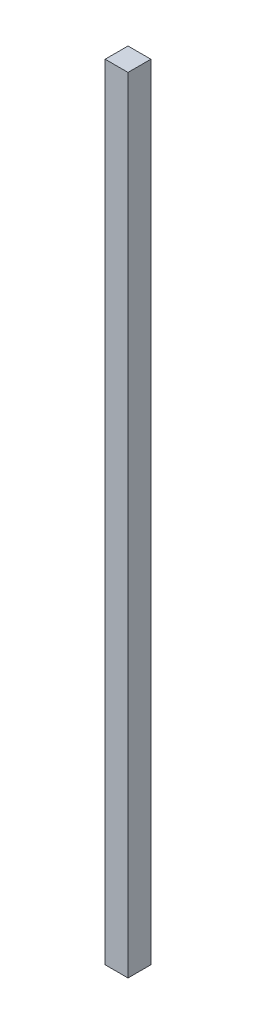
ISO-10303-21;
HEADER;
FILE_DESCRIPTION(('STEP AP214'),'2;1');
FILE_NAME('part.step','',(''),(''),'','','');
FILE_SCHEMA(('AUTOMOTIVE_DESIGN { 1 0 10303 214 1 1 1 1 }'));
ENDSEC;
DATA;
#1=APPLICATION_CONTEXT('core data for automotive mechanical design processes');
#2=APPLICATION_PROTOCOL_DEFINITION('international standard','automotive_design',2000,#1);
#3=PRODUCT_CONTEXT('',#1,'mechanical');
#4=PRODUCT('Part','Part','',(#3));
#5=PRODUCT_RELATED_PRODUCT_CATEGORY('part','',(#4));
#6=PRODUCT_DEFINITION_FORMATION('','',#4);
#7=PRODUCT_DEFINITION_CONTEXT('part definition',#1,'design');
#8=PRODUCT_DEFINITION('design','',#6,#7);
#9=PRODUCT_DEFINITION_SHAPE('','',#8);
#10=(LENGTH_UNIT() NAMED_UNIT(*) SI_UNIT(.MILLI.,.METRE.));
#11=(NAMED_UNIT(*) PLANE_ANGLE_UNIT() SI_UNIT($,.RADIAN.));
#12=(NAMED_UNIT(*) SI_UNIT($,.STERADIAN.) SOLID_ANGLE_UNIT());
#13=UNCERTAINTY_MEASURE_WITH_UNIT(LENGTH_MEASURE(1.E-05),#10,'distance_accuracy_value','');
#14=(GEOMETRIC_REPRESENTATION_CONTEXT(3) GLOBAL_UNCERTAINTY_ASSIGNED_CONTEXT((#13)) GLOBAL_UNIT_ASSIGNED_CONTEXT((#10,
#11,#12)) REPRESENTATION_CONTEXT('',''));
#15=CARTESIAN_POINT('',(0.,0.,0.));
#16=DIRECTION('',(0.,0.,1.));
#17=DIRECTION('',(1.,0.,0.));
#18=AXIS2_PLACEMENT_3D('',#15,#16,#17);
#19=CARTESIAN_POINT('',(44.45,-1524.,88.9));
#20=DIRECTION('',(-1.,0.,0.));
#21=DIRECTION('',(0.,0.,1.));
#22=AXIS2_PLACEMENT_3D('',#19,#20,#21);
#23=PLANE('',#22);
#24=DIRECTION('',(0.,1.,0.));
#25=VECTOR('',#24,1.);
#26=CARTESIAN_POINT('',(44.45,-1524.,0.));
#27=LINE('',#26,#25);
#28=CARTESIAN_POINT('',(44.45,-1524.,0.));
#29=VERTEX_POINT('',#28);
#30=CARTESIAN_POINT('',(44.45,1524.,0.));
#31=VERTEX_POINT('',#30);
#32=EDGE_CURVE('E107',#29,#31,#27,.T.);
#33=ORIENTED_EDGE('',*,*,#32,.T.);
#34=DIRECTION('',(0.,0.,-1.));
#35=VECTOR('',#34,1.);
#36=CARTESIAN_POINT('',(44.45,1524.,88.9));
#37=LINE('',#36,#35);
#38=CARTESIAN_POINT('',(44.45,1524.,88.9));
#39=VERTEX_POINT('',#38);
#40=EDGE_CURVE('E11',#39,#31,#37,.T.);
#41=ORIENTED_EDGE('',*,*,#40,.F.);
#42=DIRECTION('',(0.,1.,0.));
#43=VECTOR('',#42,1.);
#44=CARTESIAN_POINT('',(44.45,-1524.,88.9));
#45=LINE('',#44,#43);
#46=CARTESIAN_POINT('',(44.45,-1524.,88.9));
#47=VERTEX_POINT('',#46);
#48=EDGE_CURVE('E91',#47,#39,#45,.T.);
#49=ORIENTED_EDGE('',*,*,#48,.F.);
#50=DIRECTION('',(0.,0.,-1.));
#51=VECTOR('',#50,1.);
#52=CARTESIAN_POINT('',(44.45,-1524.,88.9));
#53=LINE('',#52,#51);
#54=EDGE_CURVE('E103',#47,#29,#53,.T.);
#55=ORIENTED_EDGE('',*,*,#54,.T.);
#56=EDGE_LOOP('',(#33,#41,#49,#55));
#57=FACE_BOUND('',#56,.T.);
#58=ADVANCED_FACE('F39',(#57),#23,.F.);
#59=CARTESIAN_POINT('',(-44.45,1524.,88.9));
#60=DIRECTION('',(0.,-1.,0.));
#61=DIRECTION('',(0.,0.,-1.));
#62=AXIS2_PLACEMENT_3D('',#59,#60,#61);
#63=PLANE('',#62);
#64=DIRECTION('',(-1.,0.,0.));
#65=VECTOR('',#64,1.);
#66=CARTESIAN_POINT('',(-44.45,1524.,0.));
#67=LINE('',#66,#65);
#68=CARTESIAN_POINT('',(-44.45,1524.,0.));
#69=VERTEX_POINT('',#68);
#70=EDGE_CURVE('E96',#31,#69,#67,.T.);
#71=ORIENTED_EDGE('',*,*,#70,.T.);
#72=DIRECTION('',(0.,0.,-1.));
#73=VECTOR('',#72,1.);
#74=CARTESIAN_POINT('',(-44.45,1524.,88.9));
#75=LINE('',#74,#73);
#76=CARTESIAN_POINT('',(-44.45,1524.,88.9));
#77=VERTEX_POINT('',#76);
#78=EDGE_CURVE('E48',#77,#69,#75,.T.);
#79=ORIENTED_EDGE('',*,*,#78,.F.);
#80=DIRECTION('',(-1.,0.,0.));
#81=VECTOR('',#80,1.);
#82=CARTESIAN_POINT('',(-44.45,1524.,88.9));
#83=LINE('',#82,#81);
#84=EDGE_CURVE('E86',#39,#77,#83,.T.);
#85=ORIENTED_EDGE('',*,*,#84,.F.);
#86=ORIENTED_EDGE('',*,*,#40,.T.);
#87=EDGE_LOOP('',(#71,#79,#85,#86));
#88=FACE_BOUND('',#87,.T.);
#89=ADVANCED_FACE('F95',(#88),#63,.F.);
#90=CARTESIAN_POINT('',(-44.45,-1524.,88.9));
#91=DIRECTION('',(1.,0.,0.));
#92=DIRECTION('',(0.,0.,-1.));
#93=AXIS2_PLACEMENT_3D('',#90,#91,#92);
#94=PLANE('',#93);
#95=DIRECTION('',(0.,-1.,0.));
#96=VECTOR('',#95,1.);
#97=CARTESIAN_POINT('',(-44.45,-1524.,0.));
#98=LINE('',#97,#96);
#99=CARTESIAN_POINT('',(-44.45,-1524.,0.));
#100=VERTEX_POINT('',#99);
#101=EDGE_CURVE('E73',#69,#100,#98,.T.);
#102=ORIENTED_EDGE('',*,*,#101,.T.);
#103=DIRECTION('',(0.,0.,-1.));
#104=VECTOR('',#103,1.);
#105=CARTESIAN_POINT('',(-44.45,-1524.,88.9));
#106=LINE('',#105,#104);
#107=CARTESIAN_POINT('',(-44.45,-1524.,88.9));
#108=VERTEX_POINT('',#107);
#109=EDGE_CURVE('E98',#108,#100,#106,.T.);
#110=ORIENTED_EDGE('',*,*,#109,.F.);
#111=DIRECTION('',(0.,-1.,0.));
#112=VECTOR('',#111,1.);
#113=CARTESIAN_POINT('',(-44.45,-1524.,88.9));
#114=LINE('',#113,#112);
#115=EDGE_CURVE('E89',#77,#108,#114,.T.);
#116=ORIENTED_EDGE('',*,*,#115,.F.);
#117=ORIENTED_EDGE('',*,*,#78,.T.);
#118=EDGE_LOOP('',(#102,#110,#116,#117));
#119=FACE_BOUND('',#118,.T.);
#120=ADVANCED_FACE('F99',(#119),#94,.F.);
#121=CARTESIAN_POINT('',(-44.45,-1524.,88.9));
#122=DIRECTION('',(0.,1.,0.));
#123=DIRECTION('',(0.,0.,1.));
#124=AXIS2_PLACEMENT_3D('',#121,#122,#123);
#125=PLANE('',#124);
#126=DIRECTION('',(1.,0.,0.));
#127=VECTOR('',#126,1.);
#128=CARTESIAN_POINT('',(-44.45,-1524.,0.));
#129=LINE('',#128,#127);
#130=EDGE_CURVE('E79',#100,#29,#129,.T.);
#131=ORIENTED_EDGE('',*,*,#130,.T.);
#132=ORIENTED_EDGE('',*,*,#54,.F.);
#133=DIRECTION('',(1.,0.,0.));
#134=VECTOR('',#133,1.);
#135=CARTESIAN_POINT('',(-44.45,-1524.,88.9));
#136=LINE('',#135,#134);
#137=EDGE_CURVE('E56',#108,#47,#136,.T.);
#138=ORIENTED_EDGE('',*,*,#137,.F.);
#139=ORIENTED_EDGE('',*,*,#109,.T.);
#140=EDGE_LOOP('',(#131,#132,#138,#139));
#141=FACE_BOUND('',#140,.T.);
#142=ADVANCED_FACE('F120',(#141),#125,.F.);
#143=CARTESIAN_POINT('',(0.,0.,88.9));
#144=DIRECTION('',(0.,0.,-1.));
#145=DIRECTION('',(-1.,0.,0.));
#146=AXIS2_PLACEMENT_3D('',#143,#144,#145);
#147=PLANE('',#146);
#148=ORIENTED_EDGE('',*,*,#48,.T.);
#149=ORIENTED_EDGE('',*,*,#84,.T.);
#150=ORIENTED_EDGE('',*,*,#115,.T.);
#151=ORIENTED_EDGE('',*,*,#137,.T.);
#152=EDGE_LOOP('',(#148,#149,#150,#151));
#153=FACE_BOUND('',#152,.T.);
#154=ADVANCED_FACE('F87',(#153),#147,.F.);
#155=CARTESIAN_POINT('',(0.,0.,0.));
#156=DIRECTION('',(0.,0.,-1.));
#157=DIRECTION('',(-1.,0.,0.));
#158=AXIS2_PLACEMENT_3D('',#155,#156,#157);
#159=PLANE('',#158);
#160=ORIENTED_EDGE('',*,*,#32,.F.);
#161=ORIENTED_EDGE('',*,*,#130,.F.);
#162=ORIENTED_EDGE('',*,*,#101,.F.);
#163=ORIENTED_EDGE('',*,*,#70,.F.);
#164=EDGE_LOOP('',(#160,#161,#162,#163));
#165=FACE_BOUND('',#164,.T.);
#166=ADVANCED_FACE('F123',(#165),#159,.T.);
#167=CLOSED_SHELL('',(#58,#89,#120,#142,#154,#166));
#168=MANIFOLD_SOLID_BREP('B2',#167);
#169=ADVANCED_BREP_SHAPE_REPRESENTATION('',(#18,#168),#14);
#170=SHAPE_DEFINITION_REPRESENTATION(#9,#169);
ENDSEC;
END-ISO-10303-21;
